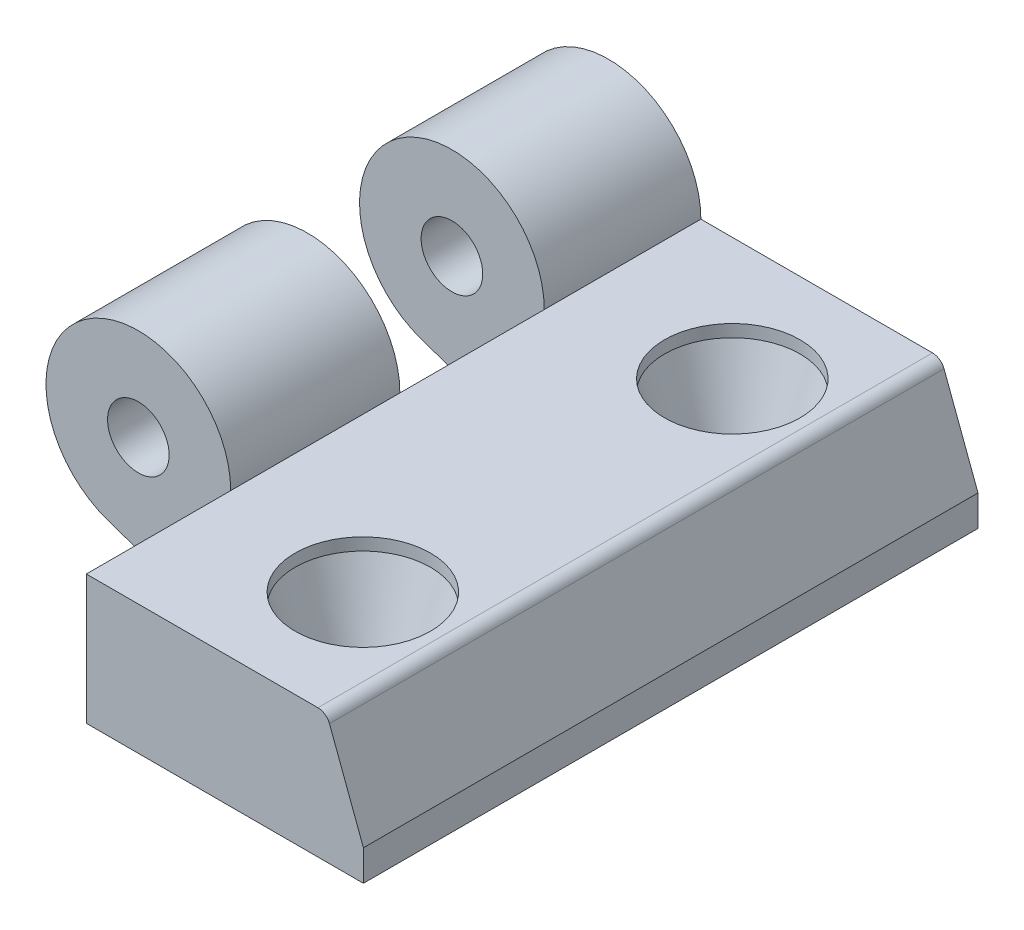
ISO-10303-21;
HEADER;
FILE_DESCRIPTION(('STEP AP214'),'2;1');
FILE_NAME('part.step','',(''),(''),'','','');
FILE_SCHEMA(('AUTOMOTIVE_DESIGN { 1 0 10303 214 1 1 1 1 }'));
ENDSEC;
DATA;
#1=APPLICATION_CONTEXT('core data for automotive mechanical design processes');
#2=APPLICATION_PROTOCOL_DEFINITION('international standard','automotive_design',2000,#1);
#3=PRODUCT_CONTEXT('',#1,'mechanical');
#4=PRODUCT('Part','Part','',(#3));
#5=PRODUCT_RELATED_PRODUCT_CATEGORY('part','',(#4));
#6=PRODUCT_DEFINITION_FORMATION('','',#4);
#7=PRODUCT_DEFINITION_CONTEXT('part definition',#1,'design');
#8=PRODUCT_DEFINITION('design','',#6,#7);
#9=PRODUCT_DEFINITION_SHAPE('','',#8);
#10=(LENGTH_UNIT() NAMED_UNIT(*) SI_UNIT(.MILLI.,.METRE.));
#11=(NAMED_UNIT(*) PLANE_ANGLE_UNIT() SI_UNIT($,.RADIAN.));
#12=(NAMED_UNIT(*) SI_UNIT($,.STERADIAN.) SOLID_ANGLE_UNIT());
#13=UNCERTAINTY_MEASURE_WITH_UNIT(LENGTH_MEASURE(1.E-05),#10,'distance_accuracy_value','');
#14=(GEOMETRIC_REPRESENTATION_CONTEXT(3) GLOBAL_UNCERTAINTY_ASSIGNED_CONTEXT((#13)) GLOBAL_UNIT_ASSIGNED_CONTEXT((#10,
#11,#12)) REPRESENTATION_CONTEXT('',''));
#15=CARTESIAN_POINT('',(0.,0.,0.));
#16=DIRECTION('',(0.,0.,1.));
#17=DIRECTION('',(1.,0.,0.));
#18=AXIS2_PLACEMENT_3D('',#15,#16,#17);
#19=CARTESIAN_POINT('',(20.,-10.5,-15.));
#20=DIRECTION('',(0.,-1.,0.));
#21=DIRECTION('',(0.,0.,-1.));
#22=AXIS2_PLACEMENT_3D('',#19,#20,#21);
#23=CYLINDRICAL_SURFACE('',#22,5.5);
#24=CARTESIAN_POINT('',(20.,0.,-15.));
#25=DIRECTION('',(0.,-1.,0.));
#26=DIRECTION('',(0.,0.,-1.));
#27=AXIS2_PLACEMENT_3D('',#24,#25,#26);
#28=CIRCLE('',#27,5.5);
#29=CARTESIAN_POINT('',(20.,0.,-20.5));
#30=VERTEX_POINT('',#29);
#31=EDGE_CURVE('E206',#30,#30,#28,.F.);
#32=ORIENTED_EDGE('',*,*,#31,.T.);
#33=EDGE_LOOP('',(#32));
#34=FACE_BOUND('',#33,.T.);
#35=CARTESIAN_POINT('',(20.,-1.0000000000332,-15.));
#36=DIRECTION('',(0.,1.,0.));
#37=DIRECTION('',(0.,0.,1.));
#38=AXIS2_PLACEMENT_3D('',#35,#36,#37);
#39=CIRCLE('',#38,5.49999999996885);
#40=CARTESIAN_POINT('',(20.,-1.0000000000332,-9.50000000003115));
#41=VERTEX_POINT('',#40);
#42=EDGE_CURVE('E248',#41,#41,#39,.F.);
#43=ORIENTED_EDGE('',*,*,#42,.T.);
#44=EDGE_LOOP('',(#43));
#45=FACE_BOUND('',#44,.T.);
#46=ADVANCED_FACE('F17',(#34,#45),#23,.F.);
#47=CARTESIAN_POINT('',(20.,-10.5,15.));
#48=DIRECTION('',(0.,-1.,0.));
#49=DIRECTION('',(0.,0.,-1.));
#50=AXIS2_PLACEMENT_3D('',#47,#48,#49);
#51=CYLINDRICAL_SURFACE('',#50,5.5);
#52=CARTESIAN_POINT('',(20.,0.,15.));
#53=DIRECTION('',(0.,-1.,0.));
#54=DIRECTION('',(0.,0.,-1.));
#55=AXIS2_PLACEMENT_3D('',#52,#53,#54);
#56=CIRCLE('',#55,5.5);
#57=CARTESIAN_POINT('',(20.,0.,9.5));
#58=VERTEX_POINT('',#57);
#59=EDGE_CURVE('E120',#58,#58,#56,.F.);
#60=ORIENTED_EDGE('',*,*,#59,.T.);
#61=EDGE_LOOP('',(#60));
#62=FACE_BOUND('',#61,.T.);
#63=CARTESIAN_POINT('',(20.,-1.0000000000332,15.));
#64=DIRECTION('',(0.,1.,0.));
#65=DIRECTION('',(0.,0.,1.));
#66=AXIS2_PLACEMENT_3D('',#63,#64,#65);
#67=CIRCLE('',#66,5.49999999996998);
#68=CARTESIAN_POINT('',(20.,-1.0000000000332,20.49999999997));
#69=VERTEX_POINT('',#68);
#70=EDGE_CURVE('E207',#69,#69,#67,.F.);
#71=ORIENTED_EDGE('',*,*,#70,.T.);
#72=EDGE_LOOP('',(#71));
#73=FACE_BOUND('',#72,.T.);
#74=ADVANCED_FACE('F340',(#62,#73),#51,.F.);
#75=CARTESIAN_POINT('',(26.3069995318356,-1.,24.95));
#76=DIRECTION('',(0.,0.,-1.));
#77=DIRECTION('',(-1.,0.,0.));
#78=AXIS2_PLACEMENT_3D('',#75,#76,#77);
#79=CYLINDRICAL_SURFACE('',#78,0.999999999999949);
#80=CARTESIAN_POINT('',(26.3069995318356,-1.,24.95));
#81=DIRECTION('',(0.,0.,-1.));
#82=DIRECTION('',(-1.,0.,0.));
#83=AXIS2_PLACEMENT_3D('',#80,#81,#82);
#84=CIRCLE('',#83,0.999999999999949);
#85=CARTESIAN_POINT('',(26.3069995318353,0.,24.95));
#86=VERTEX_POINT('',#85);
#87=CARTESIAN_POINT('',(27.2433287094045,-0.648876558411652,24.95));
#88=VERTEX_POINT('',#87);
#89=EDGE_CURVE('E110',#86,#88,#84,.T.);
#90=ORIENTED_EDGE('',*,*,#89,.T.);
#91=DIRECTION('',(0.,0.,1.));
#92=VECTOR('',#91,1.);
#93=CARTESIAN_POINT('',(27.2433287094045,-0.648876558411645,24.95));
#94=LINE('',#93,#92);
#95=CARTESIAN_POINT('',(27.2433287094045,-0.648876558411652,-24.95));
#96=VERTEX_POINT('',#95);
#97=EDGE_CURVE('E108',#88,#96,#94,.F.);
#98=ORIENTED_EDGE('',*,*,#97,.T.);
#99=CARTESIAN_POINT('',(26.3069995318356,-1.,-24.95));
#100=DIRECTION('',(0.,0.,-1.));
#101=DIRECTION('',(-1.,0.,0.));
#102=AXIS2_PLACEMENT_3D('',#99,#100,#101);
#103=CIRCLE('',#102,0.999999999999949);
#104=CARTESIAN_POINT('',(26.3069995318353,0.,-24.95));
#105=VERTEX_POINT('',#104);
#106=EDGE_CURVE('E20',#96,#105,#103,.F.);
#107=ORIENTED_EDGE('',*,*,#106,.T.);
#108=DIRECTION('',(0.,0.,-1.));
#109=VECTOR('',#108,1.);
#110=CARTESIAN_POINT('',(26.3069995318351,0.,24.95));
#111=LINE('',#110,#109);
#112=EDGE_CURVE('E105',#105,#86,#111,.F.);
#113=ORIENTED_EDGE('',*,*,#112,.T.);
#114=EDGE_LOOP('',(#90,#98,#107,#113));
#115=FACE_BOUND('',#114,.T.);
#116=ADVANCED_FACE('F104',(#115),#79,.T.);
#117=CARTESIAN_POINT('',(0.,0.,-24.95));
#118=DIRECTION('',(0.,0.,1.));
#119=DIRECTION('',(1.,0.,0.));
#120=AXIS2_PLACEMENT_3D('',#117,#118,#119);
#121=CYLINDRICAL_SURFACE('',#120,2.5);
#122=CARTESIAN_POINT('',(0.,0.,-0.510000000000004));
#123=DIRECTION('',(0.,0.,1.));
#124=DIRECTION('',(1.,0.,0.));
#125=AXIS2_PLACEMENT_3D('',#122,#123,#124);
#126=CIRCLE('',#125,2.5);
#127=CARTESIAN_POINT('',(2.5,0.,-0.510000000000004));
#128=VERTEX_POINT('',#127);
#129=EDGE_CURVE('E168',#128,#128,#126,.F.);
#130=ORIENTED_EDGE('',*,*,#129,.T.);
#131=EDGE_LOOP('',(#130));
#132=FACE_BOUND('',#131,.T.);
#133=CARTESIAN_POINT('',(0.,0.,13.225));
#134=DIRECTION('',(0.,0.,1.));
#135=DIRECTION('',(1.,0.,0.));
#136=AXIS2_PLACEMENT_3D('',#133,#134,#135);
#137=CIRCLE('',#136,2.5);
#138=CARTESIAN_POINT('',(2.5,0.,13.225));
#139=VERTEX_POINT('',#138);
#140=EDGE_CURVE('E259',#139,#139,#137,.T.);
#141=ORIENTED_EDGE('',*,*,#140,.T.);
#142=EDGE_LOOP('',(#141));
#143=FACE_BOUND('',#142,.T.);
#144=ADVANCED_FACE('F327',(#132,#143),#121,.F.);
#145=CARTESIAN_POINT('',(20.,-1.0000000000332,-15.));
#146=DIRECTION('',(0.,1.,0.));
#147=DIRECTION('',(0.,0.,1.));
#148=AXIS2_PLACEMENT_3D('',#145,#146,#147);
#149=CONICAL_SURFACE('',#148,5.49999999996885,0.333244301114076);
#150=ORIENTED_EDGE('',*,*,#42,.F.);
#151=EDGE_LOOP('',(#150));
#152=FACE_BOUND('',#151,.T.);
#153=CARTESIAN_POINT('',(20.,-7.5,-15.));
#154=DIRECTION('',(0.,-1.,0.));
#155=DIRECTION('',(0.,0.,-1.));
#156=AXIS2_PLACEMENT_3D('',#153,#154,#155);
#157=CIRCLE('',#156,3.25);
#158=CARTESIAN_POINT('',(20.,-7.5,-18.25));
#159=VERTEX_POINT('',#158);
#160=EDGE_CURVE('E151',#159,#159,#157,.T.);
#161=ORIENTED_EDGE('',*,*,#160,.T.);
#162=EDGE_LOOP('',(#161));
#163=FACE_BOUND('',#162,.T.);
#164=ADVANCED_FACE('F329',(#152,#163),#149,.F.);
#165=CARTESIAN_POINT('',(20.,-1.0000000000332,15.));
#166=DIRECTION('',(0.,1.,0.));
#167=DIRECTION('',(0.,0.,1.));
#168=AXIS2_PLACEMENT_3D('',#165,#166,#167);
#169=CONICAL_SURFACE('',#168,5.49999999996998,0.333244301114076);
#170=ORIENTED_EDGE('',*,*,#70,.F.);
#171=EDGE_LOOP('',(#170));
#172=FACE_BOUND('',#171,.T.);
#173=CARTESIAN_POINT('',(20.,-7.5,15.));
#174=DIRECTION('',(0.,-1.,0.));
#175=DIRECTION('',(0.,0.,-1.));
#176=AXIS2_PLACEMENT_3D('',#173,#174,#175);
#177=CIRCLE('',#176,3.25);
#178=CARTESIAN_POINT('',(20.,-7.5,11.75));
#179=VERTEX_POINT('',#178);
#180=EDGE_CURVE('E236',#179,#179,#177,.T.);
#181=ORIENTED_EDGE('',*,*,#180,.T.);
#182=EDGE_LOOP('',(#181));
#183=FACE_BOUND('',#182,.T.);
#184=ADVANCED_FACE('F337',(#172,#183),#169,.F.);
#185=CARTESIAN_POINT('',(0.,0.,-24.95));
#186=DIRECTION('',(0.,0.,1.));
#187=DIRECTION('',(1.,0.,0.));
#188=AXIS2_PLACEMENT_3D('',#185,#186,#187);
#189=CYLINDRICAL_SURFACE('',#188,2.5);
#190=CARTESIAN_POINT('',(0.,0.,-24.95));
#191=DIRECTION('',(0.,0.,1.));
#192=DIRECTION('',(1.,0.,0.));
#193=AXIS2_PLACEMENT_3D('',#190,#191,#192);
#194=CIRCLE('',#193,2.5);
#195=CARTESIAN_POINT('',(2.5,0.,-24.95));
#196=VERTEX_POINT('',#195);
#197=EDGE_CURVE('E239',#196,#196,#194,.F.);
#198=ORIENTED_EDGE('',*,*,#197,.T.);
#199=EDGE_LOOP('',(#198));
#200=FACE_BOUND('',#199,.T.);
#201=CARTESIAN_POINT('',(0.,0.,-12.235));
#202=DIRECTION('',(0.,0.,1.));
#203=DIRECTION('',(1.,0.,0.));
#204=AXIS2_PLACEMENT_3D('',#201,#202,#203);
#205=CIRCLE('',#204,2.5);
#206=CARTESIAN_POINT('',(2.5,0.,-12.235));
#207=VERTEX_POINT('',#206);
#208=EDGE_CURVE('E235',#207,#207,#205,.T.);
#209=ORIENTED_EDGE('',*,*,#208,.T.);
#210=EDGE_LOOP('',(#209));
#211=FACE_BOUND('',#210,.T.);
#212=ADVANCED_FACE('F379',(#200,#211),#189,.F.);
#213=CARTESIAN_POINT('',(23.6712328767128,8.8767123287668,24.95));
#214=DIRECTION('',(-0.936329177569051,-0.351123441588374,0.));
#215=DIRECTION('',(0.351123441588374,-0.936329177569051,0.));
#216=AXIS2_PLACEMENT_3D('',#213,#214,#215);
#217=PLANE('',#216);
#218=ORIENTED_EDGE('',*,*,#97,.F.);
#219=DIRECTION('',(-0.351123441588374,0.936329177569051,0.));
#220=VECTOR('',#219,1.);
#221=CARTESIAN_POINT('',(30.,-8.,24.95));
#222=LINE('',#221,#220);
#223=CARTESIAN_POINT('',(30.,-7.99999999999999,24.95));
#224=VERTEX_POINT('',#223);
#225=EDGE_CURVE('E210',#224,#88,#222,.T.);
#226=ORIENTED_EDGE('',*,*,#225,.F.);
#227=DIRECTION('',(0.,0.,-1.));
#228=VECTOR('',#227,1.);
#229=CARTESIAN_POINT('',(30.,-8.,24.95));
#230=LINE('',#229,#228);
#231=CARTESIAN_POINT('',(30.,-8.,-24.95));
#232=VERTEX_POINT('',#231);
#233=EDGE_CURVE('E131',#232,#224,#230,.F.);
#234=ORIENTED_EDGE('',*,*,#233,.F.);
#235=DIRECTION('',(-0.351123441588374,0.936329177569051,0.));
#236=VECTOR('',#235,1.);
#237=CARTESIAN_POINT('',(30.,-8.,-24.95));
#238=LINE('',#237,#236);
#239=EDGE_CURVE('E128',#232,#96,#238,.T.);
#240=ORIENTED_EDGE('',*,*,#239,.T.);
#241=EDGE_LOOP('',(#218,#226,#234,#240));
#242=FACE_BOUND('',#241,.T.);
#243=ADVANCED_FACE('F275',(#242),#217,.F.);
#244=CARTESIAN_POINT('',(0.,0.,24.95));
#245=DIRECTION('',(0.,-1.,0.));
#246=DIRECTION('',(0.,0.,-1.));
#247=AXIS2_PLACEMENT_3D('',#244,#245,#246);
#248=PLANE('',#247);
#249=DIRECTION('',(0.,0.,-1.));
#250=VECTOR('',#249,1.);
#251=CARTESIAN_POINT('',(7.50000000000099,0.,24.95));
#252=LINE('',#251,#250);
#253=CARTESIAN_POINT('',(7.50000000000099,0.,-12.235));
#254=VERTEX_POINT('',#253);
#255=CARTESIAN_POINT('',(7.50000000000049,0.,-24.95));
#256=VERTEX_POINT('',#255);
#257=EDGE_CURVE('E233',#254,#256,#252,.T.);
#258=ORIENTED_EDGE('',*,*,#257,.F.);
#259=DIRECTION('',(0.,0.,-1.));
#260=VECTOR('',#259,1.);
#261=CARTESIAN_POINT('',(7.50000000000099,0.,-0.51));
#262=LINE('',#261,#260);
#263=CARTESIAN_POINT('',(7.50000000000049,0.,-0.51));
#264=VERTEX_POINT('',#263);
#265=EDGE_CURVE('E178',#254,#264,#262,.F.);
#266=ORIENTED_EDGE('',*,*,#265,.T.);
#267=DIRECTION('',(0.,0.,-1.));
#268=VECTOR('',#267,1.);
#269=CARTESIAN_POINT('',(7.5,0.,24.95));
#270=LINE('',#269,#268);
#271=CARTESIAN_POINT('',(7.5,0.,13.225));
#272=VERTEX_POINT('',#271);
#273=EDGE_CURVE('E119',#272,#264,#270,.T.);
#274=ORIENTED_EDGE('',*,*,#273,.F.);
#275=DIRECTION('',(0.,0.,-1.));
#276=VECTOR('',#275,1.);
#277=CARTESIAN_POINT('',(7.5,0.,24.95));
#278=LINE('',#277,#276);
#279=CARTESIAN_POINT('',(7.5,0.,24.95));
#280=VERTEX_POINT('',#279);
#281=EDGE_CURVE('E152',#272,#280,#278,.F.);
#282=ORIENTED_EDGE('',*,*,#281,.T.);
#283=DIRECTION('',(1.,0.,0.));
#284=VECTOR('',#283,1.);
#285=CARTESIAN_POINT('',(0.,0.,24.95));
#286=LINE('',#285,#284);
#287=EDGE_CURVE('E118',#86,#280,#286,.F.);
#288=ORIENTED_EDGE('',*,*,#287,.F.);
#289=ORIENTED_EDGE('',*,*,#112,.F.);
#290=DIRECTION('',(1.,0.,0.));
#291=VECTOR('',#290,1.);
#292=CARTESIAN_POINT('',(0.,0.,-24.95));
#293=LINE('',#292,#291);
#294=EDGE_CURVE('E116',#105,#256,#293,.F.);
#295=ORIENTED_EDGE('',*,*,#294,.T.);
#296=EDGE_LOOP('',(#258,#266,#274,#282,#288,#289,#295));
#297=FACE_BOUND('',#296,.T.);
#298=ORIENTED_EDGE('',*,*,#59,.F.);
#299=EDGE_LOOP('',(#298));
#300=FACE_BOUND('',#299,.T.);
#301=ORIENTED_EDGE('',*,*,#31,.F.);
#302=EDGE_LOOP('',(#301));
#303=FACE_BOUND('',#302,.T.);
#304=ADVANCED_FACE('F114',(#297,#300,#303),#248,.F.);
#305=CARTESIAN_POINT('',(0.,0.,24.95));
#306=DIRECTION('',(0.,0.,-1.));
#307=DIRECTION('',(-1.,0.,0.));
#308=AXIS2_PLACEMENT_3D('',#305,#306,#307);
#309=CYLINDRICAL_SURFACE('',#308,7.5);
#310=CARTESIAN_POINT('',(0.,0.,-24.95));
#311=DIRECTION('',(0.,0.,-1.));
#312=DIRECTION('',(-1.,0.,0.));
#313=AXIS2_PLACEMENT_3D('',#310,#311,#312);
#314=CIRCLE('',#313,7.5);
#315=CARTESIAN_POINT('',(-2.42260751675987,-7.09795553802205,-24.95));
#316=VERTEX_POINT('',#315);
#317=EDGE_CURVE('E125',#256,#316,#314,.F.);
#318=ORIENTED_EDGE('',*,*,#317,.T.);
#319=DIRECTION('',(0.,0.,1.));
#320=VECTOR('',#319,1.);
#321=CARTESIAN_POINT('',(-2.42260751675985,-7.09795553802201,24.95));
#322=LINE('',#321,#320);
#323=CARTESIAN_POINT('',(-2.42260751675987,-7.09795553802205,-12.235));
#324=VERTEX_POINT('',#323);
#325=EDGE_CURVE('E183',#316,#324,#322,.T.);
#326=ORIENTED_EDGE('',*,*,#325,.T.);
#327=CARTESIAN_POINT('',(0.,0.,-12.235));
#328=DIRECTION('',(0.,0.,-1.));
#329=DIRECTION('',(-1.,0.,0.));
#330=AXIS2_PLACEMENT_3D('',#327,#328,#329);
#331=CIRCLE('',#330,7.5);
#332=EDGE_CURVE('E179',#324,#254,#331,.T.);
#333=ORIENTED_EDGE('',*,*,#332,.T.);
#334=ORIENTED_EDGE('',*,*,#257,.T.);
#335=EDGE_LOOP('',(#318,#326,#333,#334));
#336=FACE_BOUND('',#335,.T.);
#337=ADVANCED_FACE('F302',(#336),#309,.T.);
#338=CARTESIAN_POINT('',(7.50000000000099,-10.5,-12.235));
#339=DIRECTION('',(0.,0.,-1.));
#340=DIRECTION('',(-1.,0.,0.));
#341=AXIS2_PLACEMENT_3D('',#338,#339,#340);
#342=PLANE('',#341);
#343=DIRECTION('',(-0.946692296193091,0.322139249903909,0.));
#344=VECTOR('',#343,1.);
#345=CARTESIAN_POINT('',(-2.41604334176732,-7.1001891871357,-12.235));
#346=LINE('',#345,#344);
#347=CARTESIAN_POINT('',(7.50000000000099,-10.4744077975303,-12.235));
#348=VERTEX_POINT('',#347);
#349=EDGE_CURVE('E172',#324,#348,#346,.F.);
#350=ORIENTED_EDGE('',*,*,#349,.T.);
#351=DIRECTION('',(0.,1.,0.));
#352=VECTOR('',#351,1.);
#353=CARTESIAN_POINT('',(7.50000000000099,-10.5,-12.235));
#354=LINE('',#353,#352);
#355=EDGE_CURVE('E175',#348,#254,#354,.T.);
#356=ORIENTED_EDGE('',*,*,#355,.T.);
#357=ORIENTED_EDGE('',*,*,#332,.F.);
#358=EDGE_LOOP('',(#350,#356,#357));
#359=FACE_BOUND('',#358,.T.);
#360=ORIENTED_EDGE('',*,*,#208,.F.);
#361=EDGE_LOOP('',(#360));
#362=FACE_BOUND('',#361,.T.);
#363=ADVANCED_FACE('F304',(#359,#362),#342,.F.);
#364=CARTESIAN_POINT('',(7.50000000000099,-10.5,-0.51));
#365=DIRECTION('',(1.,0.,0.));
#366=DIRECTION('',(0.,0.,-1.));
#367=AXIS2_PLACEMENT_3D('',#364,#365,#366);
#368=PLANE('',#367);
#369=ORIENTED_EDGE('',*,*,#355,.F.);
#370=DIRECTION('',(0.,0.,1.));
#371=VECTOR('',#370,1.);
#372=CARTESIAN_POINT('',(7.50000000000099,-10.4744077975303,24.95));
#373=LINE('',#372,#371);
#374=CARTESIAN_POINT('',(7.50000000000099,-10.4744077975303,-0.51));
#375=VERTEX_POINT('',#374);
#376=EDGE_CURVE('E161',#348,#375,#373,.T.);
#377=ORIENTED_EDGE('',*,*,#376,.T.);
#378=DIRECTION('',(0.,1.,0.));
#379=VECTOR('',#378,1.);
#380=CARTESIAN_POINT('',(7.50000000000099,-10.5,-0.51));
#381=LINE('',#380,#379);
#382=EDGE_CURVE('E164',#375,#264,#381,.T.);
#383=ORIENTED_EDGE('',*,*,#382,.T.);
#384=ORIENTED_EDGE('',*,*,#265,.F.);
#385=EDGE_LOOP('',(#369,#377,#383,#384));
#386=FACE_BOUND('',#385,.T.);
#387=ADVANCED_FACE('F310',(#386),#368,.F.);
#388=CARTESIAN_POINT('',(7.50000000000099,-10.5,-0.51));
#389=DIRECTION('',(0.,0.,1.));
#390=DIRECTION('',(1.,0.,0.));
#391=AXIS2_PLACEMENT_3D('',#388,#389,#390);
#392=PLANE('',#391);
#393=DIRECTION('',(-0.946692296193091,0.322139249903909,0.));
#394=VECTOR('',#393,1.);
#395=CARTESIAN_POINT('',(-2.41604334176732,-7.1001891871357,-0.51));
#396=LINE('',#395,#394);
#397=CARTESIAN_POINT('',(-2.42260751675985,-7.09795553802201,-0.510000000000002));
#398=VERTEX_POINT('',#397);
#399=EDGE_CURVE('E143',#375,#398,#396,.T.);
#400=ORIENTED_EDGE('',*,*,#399,.T.);
#401=CARTESIAN_POINT('',(0.,0.,-0.510000000000004));
#402=DIRECTION('',(0.,0.,-1.));
#403=DIRECTION('',(-1.,0.,0.));
#404=AXIS2_PLACEMENT_3D('',#401,#402,#403);
#405=CIRCLE('',#404,7.5);
#406=EDGE_CURVE('E167',#264,#398,#405,.F.);
#407=ORIENTED_EDGE('',*,*,#406,.F.);
#408=ORIENTED_EDGE('',*,*,#382,.F.);
#409=EDGE_LOOP('',(#400,#407,#408));
#410=FACE_BOUND('',#409,.T.);
#411=ORIENTED_EDGE('',*,*,#129,.F.);
#412=EDGE_LOOP('',(#411));
#413=FACE_BOUND('',#412,.T.);
#414=ADVANCED_FACE('F314',(#410,#413),#392,.F.);
#415=CARTESIAN_POINT('',(0.,0.,24.95));
#416=DIRECTION('',(0.,0.,-1.));
#417=DIRECTION('',(-1.,0.,0.));
#418=AXIS2_PLACEMENT_3D('',#415,#416,#417);
#419=CYLINDRICAL_SURFACE('',#418,7.5);
#420=ORIENTED_EDGE('',*,*,#406,.T.);
#421=DIRECTION('',(0.,0.,1.));
#422=VECTOR('',#421,1.);
#423=CARTESIAN_POINT('',(-2.42260751675985,-7.09795553802201,24.95));
#424=LINE('',#423,#422);
#425=CARTESIAN_POINT('',(-2.42260751675987,-7.09795553802205,13.225));
#426=VERTEX_POINT('',#425);
#427=EDGE_CURVE('E140',#398,#426,#424,.T.);
#428=ORIENTED_EDGE('',*,*,#427,.T.);
#429=CARTESIAN_POINT('',(0.,0.,13.225));
#430=DIRECTION('',(0.,0.,-1.));
#431=DIRECTION('',(-1.,0.,0.));
#432=AXIS2_PLACEMENT_3D('',#429,#430,#431);
#433=CIRCLE('',#432,7.5);
#434=EDGE_CURVE('E225',#426,#272,#433,.T.);
#435=ORIENTED_EDGE('',*,*,#434,.T.);
#436=ORIENTED_EDGE('',*,*,#273,.T.);
#437=EDGE_LOOP('',(#420,#428,#435,#436));
#438=FACE_BOUND('',#437,.T.);
#439=ADVANCED_FACE('F319',(#438),#419,.T.);
#440=CARTESIAN_POINT('',(7.5,-10.5,13.225));
#441=DIRECTION('',(0.,0.,-1.));
#442=DIRECTION('',(-1.,0.,0.));
#443=AXIS2_PLACEMENT_3D('',#440,#441,#442);
#444=PLANE('',#443);
#445=DIRECTION('',(-0.946692296193091,0.322139249903909,0.));
#446=VECTOR('',#445,1.);
#447=CARTESIAN_POINT('',(-2.41604334176732,-7.1001891871357,13.225));
#448=LINE('',#447,#446);
#449=CARTESIAN_POINT('',(7.5,-10.4744077975299,13.225));
#450=VERTEX_POINT('',#449);
#451=EDGE_CURVE('E142',#426,#450,#448,.F.);
#452=ORIENTED_EDGE('',*,*,#451,.T.);
#453=DIRECTION('',(0.,1.,0.));
#454=VECTOR('',#453,1.);
#455=CARTESIAN_POINT('',(7.5,-10.5,13.225));
#456=LINE('',#455,#454);
#457=EDGE_CURVE('E148',#450,#272,#456,.T.);
#458=ORIENTED_EDGE('',*,*,#457,.T.);
#459=ORIENTED_EDGE('',*,*,#434,.F.);
#460=EDGE_LOOP('',(#452,#458,#459));
#461=FACE_BOUND('',#460,.T.);
#462=ORIENTED_EDGE('',*,*,#140,.F.);
#463=EDGE_LOOP('',(#462));
#464=FACE_BOUND('',#463,.T.);
#465=ADVANCED_FACE('F321',(#461,#464),#444,.F.);
#466=CARTESIAN_POINT('',(7.5,-10.5,24.95));
#467=DIRECTION('',(1.,0.,0.));
#468=DIRECTION('',(0.,0.,-1.));
#469=AXIS2_PLACEMENT_3D('',#466,#467,#468);
#470=PLANE('',#469);
#471=DIRECTION('',(0.,0.,1.));
#472=VECTOR('',#471,1.);
#473=CARTESIAN_POINT('',(7.5,-10.4744077975299,24.95));
#474=LINE('',#473,#472);
#475=CARTESIAN_POINT('',(7.5,-10.4744077975299,24.95));
#476=VERTEX_POINT('',#475);
#477=EDGE_CURVE('E145',#450,#476,#474,.T.);
#478=ORIENTED_EDGE('',*,*,#477,.T.);
#479=DIRECTION('',(0.,1.,0.));
#480=VECTOR('',#479,1.);
#481=CARTESIAN_POINT('',(7.5,0.,24.95));
#482=LINE('',#481,#480);
#483=EDGE_CURVE('E200',#280,#476,#482,.F.);
#484=ORIENTED_EDGE('',*,*,#483,.F.);
#485=ORIENTED_EDGE('',*,*,#281,.F.);
#486=ORIENTED_EDGE('',*,*,#457,.F.);
#487=EDGE_LOOP('',(#478,#484,#485,#486));
#488=FACE_BOUND('',#487,.T.);
#489=ADVANCED_FACE('F286',(#488),#470,.F.);
#490=CARTESIAN_POINT('',(20.,-10.5,-15.));
#491=DIRECTION('',(0.,-1.,0.));
#492=DIRECTION('',(0.,0.,-1.));
#493=AXIS2_PLACEMENT_3D('',#490,#491,#492);
#494=CYLINDRICAL_SURFACE('',#493,3.25);
#495=CARTESIAN_POINT('',(20.,-10.5,-15.));
#496=DIRECTION('',(0.,-1.,0.));
#497=DIRECTION('',(0.,0.,-1.));
#498=AXIS2_PLACEMENT_3D('',#495,#496,#497);
#499=CIRCLE('',#498,3.25);
#500=CARTESIAN_POINT('',(20.,-10.5,-18.25));
#501=VERTEX_POINT('',#500);
#502=EDGE_CURVE('E157',#501,#501,#499,.F.);
#503=ORIENTED_EDGE('',*,*,#502,.F.);
#504=EDGE_LOOP('',(#503));
#505=FACE_BOUND('',#504,.T.);
#506=ORIENTED_EDGE('',*,*,#160,.F.);
#507=EDGE_LOOP('',(#506));
#508=FACE_BOUND('',#507,.T.);
#509=ADVANCED_FACE('F358',(#505,#508),#494,.F.);
#510=CARTESIAN_POINT('',(20.,-10.5,15.));
#511=DIRECTION('',(0.,-1.,0.));
#512=DIRECTION('',(0.,0.,-1.));
#513=AXIS2_PLACEMENT_3D('',#510,#511,#512);
#514=CYLINDRICAL_SURFACE('',#513,3.25);
#515=CARTESIAN_POINT('',(20.,-10.5,15.));
#516=DIRECTION('',(0.,-1.,0.));
#517=DIRECTION('',(0.,0.,-1.));
#518=AXIS2_PLACEMENT_3D('',#515,#516,#517);
#519=CIRCLE('',#518,3.25);
#520=CARTESIAN_POINT('',(20.,-10.5,11.75));
#521=VERTEX_POINT('',#520);
#522=EDGE_CURVE('E195',#521,#521,#519,.F.);
#523=ORIENTED_EDGE('',*,*,#522,.F.);
#524=EDGE_LOOP('',(#523));
#525=FACE_BOUND('',#524,.T.);
#526=ORIENTED_EDGE('',*,*,#180,.F.);
#527=EDGE_LOOP('',(#526));
#528=FACE_BOUND('',#527,.T.);
#529=ADVANCED_FACE('F355',(#525,#528),#514,.F.);
#530=CARTESIAN_POINT('',(0.,0.,-24.95));
#531=DIRECTION('',(0.,0.,1.));
#532=DIRECTION('',(1.,0.,0.));
#533=AXIS2_PLACEMENT_3D('',#530,#531,#532);
#534=PLANE('',#533);
#535=ORIENTED_EDGE('',*,*,#106,.F.);
#536=ORIENTED_EDGE('',*,*,#239,.F.);
#537=DIRECTION('',(0.,1.,0.));
#538=VECTOR('',#537,1.);
#539=CARTESIAN_POINT('',(30.,0.,-24.95));
#540=LINE('',#539,#538);
#541=CARTESIAN_POINT('',(30.,-10.5,-24.95));
#542=VERTEX_POINT('',#541);
#543=EDGE_CURVE('E127',#542,#232,#540,.T.);
#544=ORIENTED_EDGE('',*,*,#543,.F.);
#545=DIRECTION('',(1.,0.,0.));
#546=VECTOR('',#545,1.);
#547=CARTESIAN_POINT('',(0.,-10.5,-24.95));
#548=LINE('',#547,#546);
#549=CARTESIAN_POINT('',(7.57520952795494,-10.5,-24.95));
#550=VERTEX_POINT('',#549);
#551=EDGE_CURVE('E191',#550,#542,#548,.T.);
#552=ORIENTED_EDGE('',*,*,#551,.F.);
#553=DIRECTION('',(-0.946692296193091,0.322139249903909,0.));
#554=VECTOR('',#553,1.);
#555=CARTESIAN_POINT('',(-2.41604334176732,-7.1001891871357,-24.95));
#556=LINE('',#555,#554);
#557=EDGE_CURVE('E187',#550,#316,#556,.T.);
#558=ORIENTED_EDGE('',*,*,#557,.T.);
#559=ORIENTED_EDGE('',*,*,#317,.F.);
#560=ORIENTED_EDGE('',*,*,#294,.F.);
#561=EDGE_LOOP('',(#535,#536,#544,#552,#558,#559,#560));
#562=FACE_BOUND('',#561,.T.);
#563=ORIENTED_EDGE('',*,*,#197,.F.);
#564=EDGE_LOOP('',(#563));
#565=FACE_BOUND('',#564,.T.);
#566=ADVANCED_FACE('F122',(#562,#565),#534,.F.);
#567=CARTESIAN_POINT('',(30.,0.,24.95));
#568=DIRECTION('',(1.,0.,0.));
#569=DIRECTION('',(0.,0.,-1.));
#570=AXIS2_PLACEMENT_3D('',#567,#568,#569);
#571=PLANE('',#570);
#572=DIRECTION('',(0.,1.,0.));
#573=VECTOR('',#572,1.);
#574=CARTESIAN_POINT('',(30.,0.,24.95));
#575=LINE('',#574,#573);
#576=CARTESIAN_POINT('',(30.,-10.5,24.95));
#577=VERTEX_POINT('',#576);
#578=EDGE_CURVE('E202',#577,#224,#575,.T.);
#579=ORIENTED_EDGE('',*,*,#578,.F.);
#580=DIRECTION('',(0.,0.,-1.));
#581=VECTOR('',#580,1.);
#582=CARTESIAN_POINT('',(30.,-10.5,24.95));
#583=LINE('',#582,#581);
#584=EDGE_CURVE('E194',#542,#577,#583,.F.);
#585=ORIENTED_EDGE('',*,*,#584,.F.);
#586=ORIENTED_EDGE('',*,*,#543,.T.);
#587=ORIENTED_EDGE('',*,*,#233,.T.);
#588=EDGE_LOOP('',(#579,#585,#586,#587));
#589=FACE_BOUND('',#588,.T.);
#590=ADVANCED_FACE('F297',(#589),#571,.T.);
#591=CARTESIAN_POINT('',(0.,0.,24.95));
#592=DIRECTION('',(0.,0.,1.));
#593=DIRECTION('',(1.,0.,0.));
#594=AXIS2_PLACEMENT_3D('',#591,#592,#593);
#595=PLANE('',#594);
#596=ORIENTED_EDGE('',*,*,#89,.F.);
#597=ORIENTED_EDGE('',*,*,#287,.T.);
#598=ORIENTED_EDGE('',*,*,#483,.T.);
#599=DIRECTION('',(-0.946692296193091,0.322139249903909,0.));
#600=VECTOR('',#599,1.);
#601=CARTESIAN_POINT('',(-2.41604334176732,-7.1001891871357,24.95));
#602=LINE('',#601,#600);
#603=CARTESIAN_POINT('',(7.57520952795494,-10.5,24.95));
#604=VERTEX_POINT('',#603);
#605=EDGE_CURVE('E35',#476,#604,#602,.F.);
#606=ORIENTED_EDGE('',*,*,#605,.T.);
#607=DIRECTION('',(1.,0.,0.));
#608=VECTOR('',#607,1.);
#609=CARTESIAN_POINT('',(0.,-10.5,24.95));
#610=LINE('',#609,#608);
#611=EDGE_CURVE('E26',#577,#604,#610,.F.);
#612=ORIENTED_EDGE('',*,*,#611,.F.);
#613=ORIENTED_EDGE('',*,*,#578,.T.);
#614=ORIENTED_EDGE('',*,*,#225,.T.);
#615=EDGE_LOOP('',(#596,#597,#598,#606,#612,#613,#614));
#616=FACE_BOUND('',#615,.T.);
#617=ADVANCED_FACE('F277',(#616),#595,.T.);
#618=CARTESIAN_POINT('',(-2.41604334176732,-7.1001891871357,24.95));
#619=DIRECTION('',(0.322139249903909,0.946692296193091,0.));
#620=DIRECTION('',(-0.946692296193091,0.322139249903909,0.));
#621=AXIS2_PLACEMENT_3D('',#618,#619,#620);
#622=PLANE('',#621);
#623=ORIENTED_EDGE('',*,*,#451,.F.);
#624=ORIENTED_EDGE('',*,*,#427,.F.);
#625=ORIENTED_EDGE('',*,*,#399,.F.);
#626=ORIENTED_EDGE('',*,*,#376,.F.);
#627=ORIENTED_EDGE('',*,*,#349,.F.);
#628=ORIENTED_EDGE('',*,*,#325,.F.);
#629=ORIENTED_EDGE('',*,*,#557,.F.);
#630=DIRECTION('',(0.,0.,-1.));
#631=VECTOR('',#630,1.);
#632=CARTESIAN_POINT('',(7.57520952795494,-10.5,24.95));
#633=LINE('',#632,#631);
#634=EDGE_CURVE('E11',#604,#550,#633,.T.);
#635=ORIENTED_EDGE('',*,*,#634,.F.);
#636=ORIENTED_EDGE('',*,*,#605,.F.);
#637=ORIENTED_EDGE('',*,*,#477,.F.);
#638=EDGE_LOOP('',(#623,#624,#625,#626,#627,#628,#629,#635,#636,#637));
#639=FACE_BOUND('',#638,.T.);
#640=ADVANCED_FACE('F289',(#639),#622,.F.);
#641=CARTESIAN_POINT('',(0.,-10.5,24.95));
#642=DIRECTION('',(0.,-1.,0.));
#643=DIRECTION('',(0.,0.,-1.));
#644=AXIS2_PLACEMENT_3D('',#641,#642,#643);
#645=PLANE('',#644);
#646=ORIENTED_EDGE('',*,*,#611,.T.);
#647=ORIENTED_EDGE('',*,*,#634,.T.);
#648=ORIENTED_EDGE('',*,*,#551,.T.);
#649=ORIENTED_EDGE('',*,*,#584,.T.);
#650=EDGE_LOOP('',(#646,#647,#648,#649));
#651=FACE_BOUND('',#650,.T.);
#652=ORIENTED_EDGE('',*,*,#522,.T.);
#653=EDGE_LOOP('',(#652));
#654=FACE_BOUND('',#653,.T.);
#655=ORIENTED_EDGE('',*,*,#502,.T.);
#656=EDGE_LOOP('',(#655));
#657=FACE_BOUND('',#656,.T.);
#658=ADVANCED_FACE('F293',(#651,#654,#657),#645,.T.);
#659=CLOSED_SHELL('',(#46,#74,#116,#144,#164,#184,#212,#243,#304,#337,#363,#387,#414,#439,#465,
#489,#509,#529,#566,#590,#617,#640,#658));
#660=MANIFOLD_SOLID_BREP('B1',#659);
#661=ADVANCED_BREP_SHAPE_REPRESENTATION('',(#18,#660),#14);
#662=SHAPE_DEFINITION_REPRESENTATION(#9,#661);
ENDSEC;
END-ISO-10303-21;
